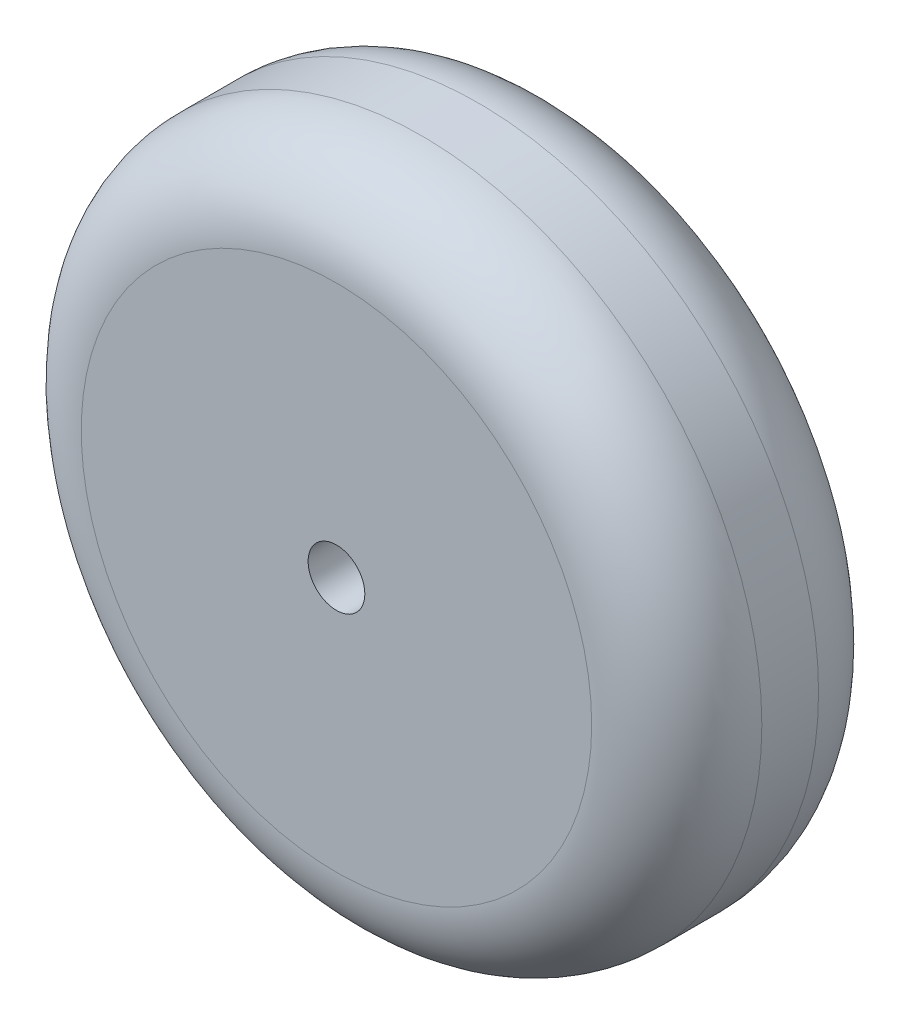
ISO-10303-21;
HEADER;
FILE_DESCRIPTION(('STEP AP214'),'2;1');
FILE_NAME('part.step','',(''),(''),'','','');
FILE_SCHEMA(('AUTOMOTIVE_DESIGN { 1 0 10303 214 1 1 1 1 }'));
ENDSEC;
DATA;
#1=APPLICATION_CONTEXT('core data for automotive mechanical design processes');
#2=APPLICATION_PROTOCOL_DEFINITION('international standard','automotive_design',2000,#1);
#3=PRODUCT_CONTEXT('',#1,'mechanical');
#4=PRODUCT('Part','Part','',(#3));
#5=PRODUCT_RELATED_PRODUCT_CATEGORY('part','',(#4));
#6=PRODUCT_DEFINITION_FORMATION('','',#4);
#7=PRODUCT_DEFINITION_CONTEXT('part definition',#1,'design');
#8=PRODUCT_DEFINITION('design','',#6,#7);
#9=PRODUCT_DEFINITION_SHAPE('','',#8);
#10=(LENGTH_UNIT() NAMED_UNIT(*) SI_UNIT(.MILLI.,.METRE.));
#11=(NAMED_UNIT(*) PLANE_ANGLE_UNIT() SI_UNIT($,.RADIAN.));
#12=(NAMED_UNIT(*) SI_UNIT($,.STERADIAN.) SOLID_ANGLE_UNIT());
#13=UNCERTAINTY_MEASURE_WITH_UNIT(LENGTH_MEASURE(1.E-05),#10,'distance_accuracy_value','');
#14=(GEOMETRIC_REPRESENTATION_CONTEXT(3) GLOBAL_UNCERTAINTY_ASSIGNED_CONTEXT((#13)) GLOBAL_UNIT_ASSIGNED_CONTEXT((#10,
#11,#12)) REPRESENTATION_CONTEXT('',''));
#15=CARTESIAN_POINT('',(0.,0.,0.));
#16=DIRECTION('',(0.,0.,1.));
#17=DIRECTION('',(1.,0.,0.));
#18=AXIS2_PLACEMENT_3D('',#15,#16,#17);
#19=CARTESIAN_POINT('',(0.,0.,20.));
#20=DIRECTION('',(0.,0.,-1.));
#21=DIRECTION('',(-1.,0.,0.));
#22=AXIS2_PLACEMENT_3D('',#19,#20,#21);
#23=CYLINDRICAL_SURFACE('',#22,30.);
#24=CARTESIAN_POINT('',(0.,0.,12.5));
#25=DIRECTION('',(0.,0.,1.));
#26=DIRECTION('',(1.,0.,0.));
#27=AXIS2_PLACEMENT_3D('',#24,#25,#26);
#28=CIRCLE('',#27,30.);
#29=CARTESIAN_POINT('',(30.,0.,12.5));
#30=VERTEX_POINT('',#29);
#31=EDGE_CURVE('E45',#30,#30,#28,.F.);
#32=ORIENTED_EDGE('',*,*,#31,.T.);
#33=EDGE_LOOP('',(#32));
#34=FACE_BOUND('',#33,.T.);
#35=CARTESIAN_POINT('',(0.,0.,7.5));
#36=DIRECTION('',(0.,0.,1.));
#37=DIRECTION('',(1.,0.,0.));
#38=AXIS2_PLACEMENT_3D('',#35,#36,#37);
#39=CIRCLE('',#38,30.);
#40=CARTESIAN_POINT('',(30.,0.,7.5));
#41=VERTEX_POINT('',#40);
#42=EDGE_CURVE('E50',#41,#41,#39,.T.);
#43=ORIENTED_EDGE('',*,*,#42,.T.);
#44=EDGE_LOOP('',(#43));
#45=FACE_BOUND('',#44,.T.);
#46=ADVANCED_FACE('F37',(#34,#45),#23,.T.);
#47=CARTESIAN_POINT('',(0.,0.,20.));
#48=DIRECTION('',(0.,0.,1.));
#49=DIRECTION('',(1.,0.,0.));
#50=AXIS2_PLACEMENT_3D('',#47,#48,#49);
#51=PLANE('',#50);
#52=CARTESIAN_POINT('',(0.,0.,20.));
#53=DIRECTION('',(0.,0.,1.));
#54=DIRECTION('',(1.,0.,0.));
#55=AXIS2_PLACEMENT_3D('',#52,#53,#54);
#56=CIRCLE('',#55,22.5);
#57=CARTESIAN_POINT('',(22.5,0.,20.));
#58=VERTEX_POINT('',#57);
#59=EDGE_CURVE('E55',#58,#58,#56,.T.);
#60=ORIENTED_EDGE('',*,*,#59,.T.);
#61=EDGE_LOOP('',(#60));
#62=FACE_BOUND('',#61,.T.);
#63=CARTESIAN_POINT('',(0.,0.,20.));
#64=DIRECTION('',(0.,0.,1.));
#65=DIRECTION('',(1.,0.,0.));
#66=AXIS2_PLACEMENT_3D('',#63,#64,#65);
#67=CIRCLE('',#66,2.5);
#68=CARTESIAN_POINT('',(2.5,0.,20.));
#69=VERTEX_POINT('',#68);
#70=EDGE_CURVE('E62',#69,#69,#67,.T.);
#71=ORIENTED_EDGE('',*,*,#70,.F.);
#72=EDGE_LOOP('',(#71));
#73=FACE_BOUND('',#72,.T.);
#74=ADVANCED_FACE('F79',(#62,#73),#51,.T.);
#75=CARTESIAN_POINT('',(0.,0.,0.));
#76=DIRECTION('',(0.,0.,1.));
#77=DIRECTION('',(1.,0.,0.));
#78=AXIS2_PLACEMENT_3D('',#75,#76,#77);
#79=PLANE('',#78);
#80=CARTESIAN_POINT('',(0.,0.,0.));
#81=DIRECTION('',(0.,0.,1.));
#82=DIRECTION('',(1.,0.,0.));
#83=AXIS2_PLACEMENT_3D('',#80,#81,#82);
#84=CIRCLE('',#83,22.5);
#85=CARTESIAN_POINT('',(22.5,0.,0.));
#86=VERTEX_POINT('',#85);
#87=EDGE_CURVE('E10',#86,#86,#84,.F.);
#88=ORIENTED_EDGE('',*,*,#87,.T.);
#89=EDGE_LOOP('',(#88));
#90=FACE_BOUND('',#89,.T.);
#91=CARTESIAN_POINT('',(0.,0.,0.));
#92=DIRECTION('',(0.,0.,1.));
#93=DIRECTION('',(1.,0.,0.));
#94=AXIS2_PLACEMENT_3D('',#91,#92,#93);
#95=CIRCLE('',#94,2.5);
#96=CARTESIAN_POINT('',(2.5,0.,0.));
#97=VERTEX_POINT('',#96);
#98=EDGE_CURVE('E61',#97,#97,#95,.T.);
#99=ORIENTED_EDGE('',*,*,#98,.T.);
#100=EDGE_LOOP('',(#99));
#101=FACE_BOUND('',#100,.T.);
#102=ADVANCED_FACE('F70',(#90,#101),#79,.F.);
#103=CARTESIAN_POINT('',(0.,0.,0.));
#104=DIRECTION('',(0.,0.,1.));
#105=DIRECTION('',(1.,0.,0.));
#106=AXIS2_PLACEMENT_3D('',#103,#104,#105);
#107=CYLINDRICAL_SURFACE('',#106,2.5);
#108=ORIENTED_EDGE('',*,*,#98,.F.);
#109=EDGE_LOOP('',(#108));
#110=FACE_BOUND('',#109,.T.);
#111=ORIENTED_EDGE('',*,*,#70,.T.);
#112=EDGE_LOOP('',(#111));
#113=FACE_BOUND('',#112,.T.);
#114=ADVANCED_FACE('F72',(#110,#113),#107,.F.);
#115=CARTESIAN_POINT('',(0.,0.,12.5));
#116=DIRECTION('',(0.,0.,1.));
#117=DIRECTION('',(1.,0.,0.));
#118=AXIS2_PLACEMENT_3D('',#115,#116,#117);
#119=TOROIDAL_SURFACE('',#118,22.5,7.5);
#120=ORIENTED_EDGE('',*,*,#31,.F.);
#121=EDGE_LOOP('',(#120));
#122=FACE_BOUND('',#121,.T.);
#123=ORIENTED_EDGE('',*,*,#59,.F.);
#124=EDGE_LOOP('',(#123));
#125=FACE_BOUND('',#124,.T.);
#126=ADVANCED_FACE('F75',(#122,#125),#119,.T.);
#127=CARTESIAN_POINT('',(0.,0.,7.5));
#128=DIRECTION('',(0.,0.,1.));
#129=DIRECTION('',(1.,0.,0.));
#130=AXIS2_PLACEMENT_3D('',#127,#128,#129);
#131=TOROIDAL_SURFACE('',#130,22.5,7.5);
#132=ORIENTED_EDGE('',*,*,#87,.F.);
#133=EDGE_LOOP('',(#132));
#134=FACE_BOUND('',#133,.T.);
#135=ORIENTED_EDGE('',*,*,#42,.F.);
#136=EDGE_LOOP('',(#135));
#137=FACE_BOUND('',#136,.T.);
#138=ADVANCED_FACE('F39',(#134,#137),#131,.T.);
#139=CLOSED_SHELL('',(#46,#74,#102,#114,#126,#138));
#140=MANIFOLD_SOLID_BREP('B2',#139);
#141=ADVANCED_BREP_SHAPE_REPRESENTATION('',(#18,#140),#14);
#142=SHAPE_DEFINITION_REPRESENTATION(#9,#141);
ENDSEC;
END-ISO-10303-21;
